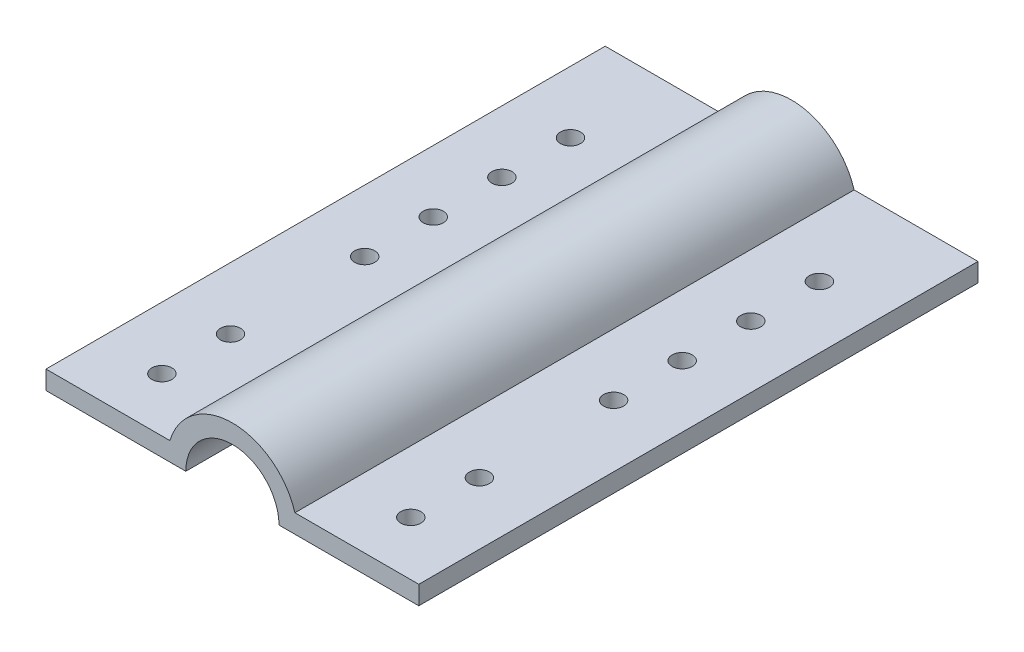
ISO-10303-21;
HEADER;
FILE_DESCRIPTION(('STEP AP214'),'2;1');
FILE_NAME('part.step','',(''),(''),'','','');
FILE_SCHEMA(('AUTOMOTIVE_DESIGN { 1 0 10303 214 1 1 1 1 }'));
ENDSEC;
DATA;
#1=APPLICATION_CONTEXT('core data for automotive mechanical design processes');
#2=APPLICATION_PROTOCOL_DEFINITION('international standard','automotive_design',2000,#1);
#3=PRODUCT_CONTEXT('',#1,'mechanical');
#4=PRODUCT('Part','Part','',(#3));
#5=PRODUCT_RELATED_PRODUCT_CATEGORY('part','',(#4));
#6=PRODUCT_DEFINITION_FORMATION('','',#4);
#7=PRODUCT_DEFINITION_CONTEXT('part definition',#1,'design');
#8=PRODUCT_DEFINITION('design','',#6,#7);
#9=PRODUCT_DEFINITION_SHAPE('','',#8);
#10=(LENGTH_UNIT() NAMED_UNIT(*) SI_UNIT(.MILLI.,.METRE.));
#11=(NAMED_UNIT(*) PLANE_ANGLE_UNIT() SI_UNIT($,.RADIAN.));
#12=(NAMED_UNIT(*) SI_UNIT($,.STERADIAN.) SOLID_ANGLE_UNIT());
#13=UNCERTAINTY_MEASURE_WITH_UNIT(LENGTH_MEASURE(1.E-05),#10,'distance_accuracy_value','');
#14=(GEOMETRIC_REPRESENTATION_CONTEXT(3) GLOBAL_UNCERTAINTY_ASSIGNED_CONTEXT((#13)) GLOBAL_UNIT_ASSIGNED_CONTEXT((#10,
#11,#12)) REPRESENTATION_CONTEXT('',''));
#15=CARTESIAN_POINT('',(0.,0.,0.));
#16=DIRECTION('',(0.,0.,1.));
#17=DIRECTION('',(1.,0.,0.));
#18=AXIS2_PLACEMENT_3D('',#15,#16,#17);
#19=CARTESIAN_POINT('',(-12.5,0.,-50.));
#20=DIRECTION('',(0.,1.,0.));
#21=DIRECTION('',(-1.,0.,0.));
#22=AXIS2_PLACEMENT_3D('',#19,#20,#21);
#23=PLANE('',#22);
#24=CARTESIAN_POINT('',(-33.3852549156242,0.,85.53));
#25=DIRECTION('',(0.,1.,0.));
#26=DIRECTION('',(-1.,0.,0.));
#27=AXIS2_PLACEMENT_3D('',#24,#25,#26);
#28=CIRCLE('',#27,2.69999999999999);
#29=CARTESIAN_POINT('',(-36.0852549156242,0.,85.53));
#30=VERTEX_POINT('',#29);
#31=EDGE_CURVE('E327',#30,#30,#28,.T.);
#32=ORIENTED_EDGE('',*,*,#31,.T.);
#33=EDGE_LOOP('',(#32));
#34=FACE_BOUND('',#33,.T.);
#35=CARTESIAN_POINT('',(-33.3852549156242,0.,67.13));
#36=DIRECTION('',(0.,1.,0.));
#37=DIRECTION('',(-1.,0.,0.));
#38=AXIS2_PLACEMENT_3D('',#35,#36,#37);
#39=CIRCLE('',#38,2.69999999999999);
#40=CARTESIAN_POINT('',(-36.0852549156242,0.,67.13));
#41=VERTEX_POINT('',#40);
#42=EDGE_CURVE('E319',#41,#41,#39,.T.);
#43=ORIENTED_EDGE('',*,*,#42,.T.);
#44=EDGE_LOOP('',(#43));
#45=FACE_BOUND('',#44,.T.);
#46=CARTESIAN_POINT('',(-33.3852549156242,0.,31.13));
#47=DIRECTION('',(0.,1.,0.));
#48=DIRECTION('',(-1.,0.,0.));
#49=AXIS2_PLACEMENT_3D('',#46,#47,#48);
#50=CIRCLE('',#49,2.7);
#51=CARTESIAN_POINT('',(-36.0852549156242,0.,31.13));
#52=VERTEX_POINT('',#51);
#53=EDGE_CURVE('E311',#52,#52,#50,.T.);
#54=ORIENTED_EDGE('',*,*,#53,.T.);
#55=EDGE_LOOP('',(#54));
#56=FACE_BOUND('',#55,.T.);
#57=CARTESIAN_POINT('',(-33.3852549156242,0.,12.73));
#58=DIRECTION('',(0.,1.,0.));
#59=DIRECTION('',(-1.,0.,0.));
#60=AXIS2_PLACEMENT_3D('',#57,#58,#59);
#61=CIRCLE('',#60,2.7);
#62=CARTESIAN_POINT('',(-36.0852549156242,0.,12.73));
#63=VERTEX_POINT('',#62);
#64=EDGE_CURVE('E303',#63,#63,#61,.T.);
#65=ORIENTED_EDGE('',*,*,#64,.T.);
#66=EDGE_LOOP('',(#65));
#67=FACE_BOUND('',#66,.T.);
#68=CARTESIAN_POINT('',(-33.3852549156242,0.,-5.67));
#69=DIRECTION('',(0.,1.,0.));
#70=DIRECTION('',(-1.,0.,0.));
#71=AXIS2_PLACEMENT_3D('',#68,#69,#70);
#72=CIRCLE('',#71,2.7);
#73=CARTESIAN_POINT('',(-36.0852549156242,0.,-5.67));
#74=VERTEX_POINT('',#73);
#75=EDGE_CURVE('E295',#74,#74,#72,.T.);
#76=ORIENTED_EDGE('',*,*,#75,.T.);
#77=EDGE_LOOP('',(#76));
#78=FACE_BOUND('',#77,.T.);
#79=CARTESIAN_POINT('',(-33.3852549156242,0.,-24.07));
#80=DIRECTION('',(0.,1.,0.));
#81=DIRECTION('',(-1.,0.,0.));
#82=AXIS2_PLACEMENT_3D('',#79,#80,#81);
#83=CIRCLE('',#82,2.7);
#84=CARTESIAN_POINT('',(-36.0852549156242,0.,-24.07));
#85=VERTEX_POINT('',#84);
#86=EDGE_CURVE('E291',#85,#85,#83,.T.);
#87=ORIENTED_EDGE('',*,*,#86,.T.);
#88=EDGE_LOOP('',(#87));
#89=FACE_BOUND('',#88,.T.);
#90=DIRECTION('',(0.,0.,1.));
#91=VECTOR('',#90,1.);
#92=CARTESIAN_POINT('',(-12.5,0.,-50.));
#93=LINE('',#92,#91);
#94=CARTESIAN_POINT('',(-12.5,0.,-50.));
#95=VERTEX_POINT('',#94);
#96=CARTESIAN_POINT('',(-12.5,0.,28.7353643915636));
#97=VERTEX_POINT('',#96);
#98=EDGE_CURVE('E164',#95,#97,#93,.T.);
#99=ORIENTED_EDGE('',*,*,#98,.T.);
#100=CARTESIAN_POINT('',(0.,0.,50.0437672996852));
#101=DIRECTION('',(0.,-1.,0.));
#102=DIRECTION('',(1.,0.,0.));
#103=AXIS2_PLACEMENT_3D('',#100,#101,#102);
#104=CIRCLE('',#103,24.704210865657);
#105=CARTESIAN_POINT('',(-12.5,0.,71.3521702078068));
#106=VERTEX_POINT('',#105);
#107=EDGE_CURVE('E256',#106,#97,#104,.T.);
#108=ORIENTED_EDGE('',*,*,#107,.F.);
#109=CARTESIAN_POINT('',(-12.5,0.,100.));
#110=VERTEX_POINT('',#109);
#111=EDGE_CURVE('E248',#106,#110,#93,.T.);
#112=ORIENTED_EDGE('',*,*,#111,.T.);
#113=DIRECTION('',(-1.,0.,0.));
#114=VECTOR('',#113,1.);
#115=CARTESIAN_POINT('',(-12.5,0.,100.));
#116=LINE('',#115,#114);
#117=CARTESIAN_POINT('',(-50.,0.,100.));
#118=VERTEX_POINT('',#117);
#119=EDGE_CURVE('E203',#110,#118,#116,.T.);
#120=ORIENTED_EDGE('',*,*,#119,.T.);
#121=DIRECTION('',(0.,0.,1.));
#122=VECTOR('',#121,1.);
#123=CARTESIAN_POINT('',(-50.,0.,-50.));
#124=LINE('',#123,#122);
#125=CARTESIAN_POINT('',(-50.,0.,-50.));
#126=VERTEX_POINT('',#125);
#127=EDGE_CURVE('E11',#126,#118,#124,.T.);
#128=ORIENTED_EDGE('',*,*,#127,.F.);
#129=DIRECTION('',(-1.,0.,0.));
#130=VECTOR('',#129,1.);
#131=CARTESIAN_POINT('',(-12.5,0.,-50.));
#132=LINE('',#131,#130);
#133=EDGE_CURVE('E228',#95,#126,#132,.T.);
#134=ORIENTED_EDGE('',*,*,#133,.F.);
#135=EDGE_LOOP('',(#99,#108,#112,#120,#128,#134));
#136=FACE_BOUND('',#135,.T.);
#137=ADVANCED_FACE('F39',(#34,#45,#56,#67,#78,#89,#136),#23,.F.);
#138=CARTESIAN_POINT('',(-50.,4.99999999999999,-50.));
#139=DIRECTION('',(-1.,0.,0.));
#140=DIRECTION('',(0.,0.,1.));
#141=AXIS2_PLACEMENT_3D('',#138,#139,#140);
#142=PLANE('',#141);
#143=ORIENTED_EDGE('',*,*,#127,.T.);
#144=DIRECTION('',(0.,-1.,0.));
#145=VECTOR('',#144,1.);
#146=CARTESIAN_POINT('',(-50.,4.99999999999999,100.));
#147=LINE('',#146,#145);
#148=CARTESIAN_POINT('',(-50.,4.99999999999999,100.));
#149=VERTEX_POINT('',#148);
#150=EDGE_CURVE('E193',#149,#118,#147,.T.);
#151=ORIENTED_EDGE('',*,*,#150,.F.);
#152=DIRECTION('',(0.,0.,1.));
#153=VECTOR('',#152,1.);
#154=CARTESIAN_POINT('',(-50.,4.99999999999999,-50.));
#155=LINE('',#154,#153);
#156=CARTESIAN_POINT('',(-50.,4.99999999999999,-50.));
#157=VERTEX_POINT('',#156);
#158=EDGE_CURVE('E47',#157,#149,#155,.T.);
#159=ORIENTED_EDGE('',*,*,#158,.F.);
#160=DIRECTION('',(0.,-1.,0.));
#161=VECTOR('',#160,1.);
#162=CARTESIAN_POINT('',(-50.,4.99999999999999,-50.));
#163=LINE('',#162,#161);
#164=EDGE_CURVE('E231',#157,#126,#163,.T.);
#165=ORIENTED_EDGE('',*,*,#164,.T.);
#166=EDGE_LOOP('',(#143,#151,#159,#165));
#167=FACE_BOUND('',#166,.T.);
#168=ADVANCED_FACE('F200',(#167),#142,.T.);
#169=CARTESIAN_POINT('',(-16.7705098312484,5.,-50.));
#170=DIRECTION('',(0.,1.,0.));
#171=DIRECTION('',(-1.,0.,0.));
#172=AXIS2_PLACEMENT_3D('',#169,#170,#171);
#173=PLANE('',#172);
#174=CARTESIAN_POINT('',(-33.3852549156242,4.99999999999999,85.53));
#175=DIRECTION('',(0.,1.,0.));
#176=DIRECTION('',(-1.,0.,0.));
#177=AXIS2_PLACEMENT_3D('',#174,#175,#176);
#178=CIRCLE('',#177,2.69999999999999);
#179=CARTESIAN_POINT('',(-36.0852549156242,4.99999999999999,85.53));
#180=VERTEX_POINT('',#179);
#181=EDGE_CURVE('E331',#180,#180,#178,.F.);
#182=ORIENTED_EDGE('',*,*,#181,.T.);
#183=EDGE_LOOP('',(#182));
#184=FACE_BOUND('',#183,.T.);
#185=CARTESIAN_POINT('',(-33.3852549156242,4.99999999999999,67.13));
#186=DIRECTION('',(0.,1.,0.));
#187=DIRECTION('',(-1.,0.,0.));
#188=AXIS2_PLACEMENT_3D('',#185,#186,#187);
#189=CIRCLE('',#188,2.69999999999999);
#190=CARTESIAN_POINT('',(-36.0852549156242,4.99999999999999,67.13));
#191=VERTEX_POINT('',#190);
#192=EDGE_CURVE('E323',#191,#191,#189,.F.);
#193=ORIENTED_EDGE('',*,*,#192,.T.);
#194=EDGE_LOOP('',(#193));
#195=FACE_BOUND('',#194,.T.);
#196=CARTESIAN_POINT('',(-33.3852549156242,4.99999999999999,31.13));
#197=DIRECTION('',(0.,1.,0.));
#198=DIRECTION('',(-1.,0.,0.));
#199=AXIS2_PLACEMENT_3D('',#196,#197,#198);
#200=CIRCLE('',#199,2.7);
#201=CARTESIAN_POINT('',(-36.0852549156242,4.99999999999999,31.13));
#202=VERTEX_POINT('',#201);
#203=EDGE_CURVE('E315',#202,#202,#200,.F.);
#204=ORIENTED_EDGE('',*,*,#203,.T.);
#205=EDGE_LOOP('',(#204));
#206=FACE_BOUND('',#205,.T.);
#207=CARTESIAN_POINT('',(-33.3852549156242,4.99999999999999,12.73));
#208=DIRECTION('',(0.,1.,0.));
#209=DIRECTION('',(-1.,0.,0.));
#210=AXIS2_PLACEMENT_3D('',#207,#208,#209);
#211=CIRCLE('',#210,2.7);
#212=CARTESIAN_POINT('',(-36.0852549156242,4.99999999999999,12.73));
#213=VERTEX_POINT('',#212);
#214=EDGE_CURVE('E307',#213,#213,#211,.F.);
#215=ORIENTED_EDGE('',*,*,#214,.T.);
#216=EDGE_LOOP('',(#215));
#217=FACE_BOUND('',#216,.T.);
#218=CARTESIAN_POINT('',(-33.3852549156242,4.99999999999999,-5.67));
#219=DIRECTION('',(0.,1.,0.));
#220=DIRECTION('',(-1.,0.,0.));
#221=AXIS2_PLACEMENT_3D('',#218,#219,#220);
#222=CIRCLE('',#221,2.7);
#223=CARTESIAN_POINT('',(-36.0852549156242,4.99999999999999,-5.67));
#224=VERTEX_POINT('',#223);
#225=EDGE_CURVE('E299',#224,#224,#222,.F.);
#226=ORIENTED_EDGE('',*,*,#225,.T.);
#227=EDGE_LOOP('',(#226));
#228=FACE_BOUND('',#227,.T.);
#229=CARTESIAN_POINT('',(-33.3852549156242,4.99999999999999,-24.07));
#230=DIRECTION('',(0.,1.,0.));
#231=DIRECTION('',(-1.,0.,0.));
#232=AXIS2_PLACEMENT_3D('',#229,#230,#231);
#233=CIRCLE('',#232,2.7);
#234=CARTESIAN_POINT('',(-36.0852549156242,4.99999999999999,-24.07));
#235=VERTEX_POINT('',#234);
#236=EDGE_CURVE('E151',#235,#235,#233,.F.);
#237=ORIENTED_EDGE('',*,*,#236,.T.);
#238=EDGE_LOOP('',(#237));
#239=FACE_BOUND('',#238,.T.);
#240=ORIENTED_EDGE('',*,*,#158,.T.);
#241=DIRECTION('',(-1.,0.,0.));
#242=VECTOR('',#241,1.);
#243=CARTESIAN_POINT('',(-16.7705098312484,5.,100.));
#244=LINE('',#243,#242);
#245=CARTESIAN_POINT('',(-16.7705098312484,5.,100.));
#246=VERTEX_POINT('',#245);
#247=EDGE_CURVE('E181',#246,#149,#244,.T.);
#248=ORIENTED_EDGE('',*,*,#247,.F.);
#249=DIRECTION('',(0.,0.,1.));
#250=VECTOR('',#249,1.);
#251=CARTESIAN_POINT('',(-16.7705098312484,5.,-50.));
#252=LINE('',#251,#250);
#253=CARTESIAN_POINT('',(-16.7705098312484,5.,-50.));
#254=VERTEX_POINT('',#253);
#255=EDGE_CURVE('E173',#254,#246,#252,.T.);
#256=ORIENTED_EDGE('',*,*,#255,.F.);
#257=DIRECTION('',(-1.,0.,0.));
#258=VECTOR('',#257,1.);
#259=CARTESIAN_POINT('',(-16.7705098312484,5.,-50.));
#260=LINE('',#259,#258);
#261=EDGE_CURVE('E184',#254,#157,#260,.T.);
#262=ORIENTED_EDGE('',*,*,#261,.T.);
#263=EDGE_LOOP('',(#240,#248,#256,#262));
#264=FACE_BOUND('',#263,.T.);
#265=ADVANCED_FACE('F180',(#184,#195,#206,#217,#228,#239,#264),#173,.T.);
#266=CARTESIAN_POINT('',(0.,0.,-50.));
#267=DIRECTION('',(0.,0.,1.));
#268=DIRECTION('',(1.,0.,0.));
#269=AXIS2_PLACEMENT_3D('',#266,#267,#268);
#270=CYLINDRICAL_SURFACE('',#269,17.5);
#271=ORIENTED_EDGE('',*,*,#255,.T.);
#272=CARTESIAN_POINT('',(0.,0.,100.));
#273=DIRECTION('',(0.,0.,-1.));
#274=DIRECTION('',(-1.,0.,0.));
#275=AXIS2_PLACEMENT_3D('',#272,#273,#274);
#276=CIRCLE('',#275,17.5);
#277=CARTESIAN_POINT('',(16.7705098312484,5.,100.));
#278=VERTEX_POINT('',#277);
#279=EDGE_CURVE('E197',#246,#278,#276,.T.);
#280=ORIENTED_EDGE('',*,*,#279,.T.);
#281=DIRECTION('',(0.,0.,1.));
#282=VECTOR('',#281,1.);
#283=CARTESIAN_POINT('',(16.7705098312484,5.,-50.));
#284=LINE('',#283,#282);
#285=CARTESIAN_POINT('',(16.7705098312484,5.,-50.));
#286=VERTEX_POINT('',#285);
#287=EDGE_CURVE('E170',#286,#278,#284,.T.);
#288=ORIENTED_EDGE('',*,*,#287,.F.);
#289=CARTESIAN_POINT('',(0.,0.,-50.));
#290=DIRECTION('',(0.,0.,-1.));
#291=DIRECTION('',(-1.,0.,0.));
#292=AXIS2_PLACEMENT_3D('',#289,#290,#291);
#293=CIRCLE('',#292,17.5);
#294=EDGE_CURVE('E236',#254,#286,#293,.T.);
#295=ORIENTED_EDGE('',*,*,#294,.F.);
#296=EDGE_LOOP('',(#271,#280,#288,#295));
#297=FACE_BOUND('',#296,.T.);
#298=ADVANCED_FACE('F391',(#297),#270,.T.);
#299=CARTESIAN_POINT('',(16.7705098312484,5.,-50.));
#300=DIRECTION('',(0.,-1.,0.));
#301=DIRECTION('',(1.,0.,0.));
#302=AXIS2_PLACEMENT_3D('',#299,#300,#301);
#303=PLANE('',#302);
#304=CARTESIAN_POINT('',(33.3852549156242,5.00000000000001,-24.07));
#305=DIRECTION('',(0.,1.,0.));
#306=DIRECTION('',(-1.,0.,0.));
#307=AXIS2_PLACEMENT_3D('',#304,#305,#306);
#308=CIRCLE('',#307,2.7);
#309=CARTESIAN_POINT('',(30.6852549156242,5.00000000000001,-24.07));
#310=VERTEX_POINT('',#309);
#311=EDGE_CURVE('E339',#310,#310,#308,.T.);
#312=ORIENTED_EDGE('',*,*,#311,.F.);
#313=EDGE_LOOP('',(#312));
#314=FACE_BOUND('',#313,.T.);
#315=CARTESIAN_POINT('',(33.3852549156242,5.00000000000001,-5.67000000000001));
#316=DIRECTION('',(0.,1.,0.));
#317=DIRECTION('',(-1.,0.,0.));
#318=AXIS2_PLACEMENT_3D('',#315,#316,#317);
#319=CIRCLE('',#318,2.7);
#320=CARTESIAN_POINT('',(30.6852549156242,5.00000000000001,-5.67000000000001));
#321=VERTEX_POINT('',#320);
#322=EDGE_CURVE('E347',#321,#321,#319,.T.);
#323=ORIENTED_EDGE('',*,*,#322,.F.);
#324=EDGE_LOOP('',(#323));
#325=FACE_BOUND('',#324,.T.);
#326=CARTESIAN_POINT('',(33.3852549156242,5.00000000000001,31.13));
#327=DIRECTION('',(0.,1.,0.));
#328=DIRECTION('',(-1.,0.,0.));
#329=AXIS2_PLACEMENT_3D('',#326,#327,#328);
#330=CIRCLE('',#329,2.7);
#331=CARTESIAN_POINT('',(30.6852549156242,5.00000000000001,31.13));
#332=VERTEX_POINT('',#331);
#333=EDGE_CURVE('E355',#332,#332,#330,.T.);
#334=ORIENTED_EDGE('',*,*,#333,.F.);
#335=EDGE_LOOP('',(#334));
#336=FACE_BOUND('',#335,.T.);
#337=CARTESIAN_POINT('',(33.3852549156242,5.00000000000001,67.13));
#338=DIRECTION('',(0.,1.,0.));
#339=DIRECTION('',(-1.,0.,0.));
#340=AXIS2_PLACEMENT_3D('',#337,#338,#339);
#341=CIRCLE('',#340,2.7);
#342=CARTESIAN_POINT('',(30.6852549156242,5.00000000000001,67.13));
#343=VERTEX_POINT('',#342);
#344=EDGE_CURVE('E363',#343,#343,#341,.T.);
#345=ORIENTED_EDGE('',*,*,#344,.F.);
#346=EDGE_LOOP('',(#345));
#347=FACE_BOUND('',#346,.T.);
#348=CARTESIAN_POINT('',(33.3852549156242,5.00000000000001,85.53));
#349=DIRECTION('',(0.,1.,0.));
#350=DIRECTION('',(-1.,0.,0.));
#351=AXIS2_PLACEMENT_3D('',#348,#349,#350);
#352=CIRCLE('',#351,2.7);
#353=CARTESIAN_POINT('',(30.6852549156242,5.00000000000001,85.53));
#354=VERTEX_POINT('',#353);
#355=EDGE_CURVE('E371',#354,#354,#352,.T.);
#356=ORIENTED_EDGE('',*,*,#355,.F.);
#357=EDGE_LOOP('',(#356));
#358=FACE_BOUND('',#357,.T.);
#359=CARTESIAN_POINT('',(33.3852549156242,5.00000000000001,12.73));
#360=DIRECTION('',(0.,1.,0.));
#361=DIRECTION('',(-1.,0.,0.));
#362=AXIS2_PLACEMENT_3D('',#359,#360,#361);
#363=CIRCLE('',#362,2.7);
#364=CARTESIAN_POINT('',(30.6852549156242,5.00000000000001,12.73));
#365=VERTEX_POINT('',#364);
#366=EDGE_CURVE('E379',#365,#365,#363,.T.);
#367=ORIENTED_EDGE('',*,*,#366,.F.);
#368=EDGE_LOOP('',(#367));
#369=FACE_BOUND('',#368,.T.);
#370=ORIENTED_EDGE('',*,*,#287,.T.);
#371=DIRECTION('',(1.,0.,0.));
#372=VECTOR('',#371,1.);
#373=CARTESIAN_POINT('',(16.7705098312484,5.,100.));
#374=LINE('',#373,#372);
#375=CARTESIAN_POINT('',(50.,5.00000000000001,100.));
#376=VERTEX_POINT('',#375);
#377=EDGE_CURVE('E212',#278,#376,#374,.T.);
#378=ORIENTED_EDGE('',*,*,#377,.T.);
#379=DIRECTION('',(0.,0.,1.));
#380=VECTOR('',#379,1.);
#381=CARTESIAN_POINT('',(50.,5.00000000000001,-50.));
#382=LINE('',#381,#380);
#383=CARTESIAN_POINT('',(50.,5.00000000000001,-50.));
#384=VERTEX_POINT('',#383);
#385=EDGE_CURVE('E162',#384,#376,#382,.T.);
#386=ORIENTED_EDGE('',*,*,#385,.F.);
#387=DIRECTION('',(1.,0.,0.));
#388=VECTOR('',#387,1.);
#389=CARTESIAN_POINT('',(16.7705098312484,5.,-50.));
#390=LINE('',#389,#388);
#391=EDGE_CURVE('E239',#286,#384,#390,.T.);
#392=ORIENTED_EDGE('',*,*,#391,.F.);
#393=EDGE_LOOP('',(#370,#378,#386,#392));
#394=FACE_BOUND('',#393,.T.);
#395=ADVANCED_FACE('F387',(#314,#325,#336,#347,#358,#369,#394),#303,.F.);
#396=CARTESIAN_POINT('',(50.,5.00000000000001,-50.));
#397=DIRECTION('',(-1.,0.,0.));
#398=DIRECTION('',(0.,0.,1.));
#399=AXIS2_PLACEMENT_3D('',#396,#397,#398);
#400=PLANE('',#399);
#401=ORIENTED_EDGE('',*,*,#385,.T.);
#402=DIRECTION('',(0.,-1.,0.));
#403=VECTOR('',#402,1.);
#404=CARTESIAN_POINT('',(50.,5.00000000000001,100.));
#405=LINE('',#404,#403);
#406=CARTESIAN_POINT('',(50.,0.,100.));
#407=VERTEX_POINT('',#406);
#408=EDGE_CURVE('E216',#376,#407,#405,.T.);
#409=ORIENTED_EDGE('',*,*,#408,.T.);
#410=DIRECTION('',(0.,0.,1.));
#411=VECTOR('',#410,1.);
#412=CARTESIAN_POINT('',(50.,0.,-50.));
#413=LINE('',#412,#411);
#414=CARTESIAN_POINT('',(50.,0.,-50.));
#415=VERTEX_POINT('',#414);
#416=EDGE_CURVE('E158',#415,#407,#413,.T.);
#417=ORIENTED_EDGE('',*,*,#416,.F.);
#418=DIRECTION('',(0.,-1.,0.));
#419=VECTOR('',#418,1.);
#420=CARTESIAN_POINT('',(50.,5.00000000000001,-50.));
#421=LINE('',#420,#419);
#422=EDGE_CURVE('E242',#384,#415,#421,.T.);
#423=ORIENTED_EDGE('',*,*,#422,.F.);
#424=EDGE_LOOP('',(#401,#409,#417,#423));
#425=FACE_BOUND('',#424,.T.);
#426=ADVANCED_FACE('F390',(#425),#400,.F.);
#427=CARTESIAN_POINT('',(12.5,0.,-50.));
#428=DIRECTION('',(0.,-1.,0.));
#429=DIRECTION('',(1.,0.,0.));
#430=AXIS2_PLACEMENT_3D('',#427,#428,#429);
#431=PLANE('',#430);
#432=CARTESIAN_POINT('',(33.3852549156242,0.,-24.07));
#433=DIRECTION('',(0.,-1.,0.));
#434=DIRECTION('',(1.,0.,0.));
#435=AXIS2_PLACEMENT_3D('',#432,#433,#434);
#436=CIRCLE('',#435,2.7);
#437=CARTESIAN_POINT('',(36.0852549156242,0.,-24.07));
#438=VERTEX_POINT('',#437);
#439=EDGE_CURVE('E335',#438,#438,#436,.F.);
#440=ORIENTED_EDGE('',*,*,#439,.T.);
#441=EDGE_LOOP('',(#440));
#442=FACE_BOUND('',#441,.T.);
#443=CARTESIAN_POINT('',(33.3852549156242,0.,-5.67000000000001));
#444=DIRECTION('',(0.,-1.,0.));
#445=DIRECTION('',(1.,0.,0.));
#446=AXIS2_PLACEMENT_3D('',#443,#444,#445);
#447=CIRCLE('',#446,2.7);
#448=CARTESIAN_POINT('',(36.0852549156242,0.,-5.67000000000001));
#449=VERTEX_POINT('',#448);
#450=EDGE_CURVE('E343',#449,#449,#447,.F.);
#451=ORIENTED_EDGE('',*,*,#450,.T.);
#452=EDGE_LOOP('',(#451));
#453=FACE_BOUND('',#452,.T.);
#454=CARTESIAN_POINT('',(33.3852549156242,0.,31.13));
#455=DIRECTION('',(0.,-1.,0.));
#456=DIRECTION('',(1.,0.,0.));
#457=AXIS2_PLACEMENT_3D('',#454,#455,#456);
#458=CIRCLE('',#457,2.7);
#459=CARTESIAN_POINT('',(36.0852549156242,0.,31.13));
#460=VERTEX_POINT('',#459);
#461=EDGE_CURVE('E351',#460,#460,#458,.F.);
#462=ORIENTED_EDGE('',*,*,#461,.T.);
#463=EDGE_LOOP('',(#462));
#464=FACE_BOUND('',#463,.T.);
#465=CARTESIAN_POINT('',(33.3852549156242,0.,67.13));
#466=DIRECTION('',(0.,-1.,0.));
#467=DIRECTION('',(1.,0.,0.));
#468=AXIS2_PLACEMENT_3D('',#465,#466,#467);
#469=CIRCLE('',#468,2.7);
#470=CARTESIAN_POINT('',(36.0852549156242,0.,67.13));
#471=VERTEX_POINT('',#470);
#472=EDGE_CURVE('E359',#471,#471,#469,.F.);
#473=ORIENTED_EDGE('',*,*,#472,.T.);
#474=EDGE_LOOP('',(#473));
#475=FACE_BOUND('',#474,.T.);
#476=CARTESIAN_POINT('',(33.3852549156242,0.,85.53));
#477=DIRECTION('',(0.,-1.,0.));
#478=DIRECTION('',(1.,0.,0.));
#479=AXIS2_PLACEMENT_3D('',#476,#477,#478);
#480=CIRCLE('',#479,2.7);
#481=CARTESIAN_POINT('',(36.0852549156242,0.,85.53));
#482=VERTEX_POINT('',#481);
#483=EDGE_CURVE('E367',#482,#482,#480,.F.);
#484=ORIENTED_EDGE('',*,*,#483,.T.);
#485=EDGE_LOOP('',(#484));
#486=FACE_BOUND('',#485,.T.);
#487=CARTESIAN_POINT('',(33.3852549156242,0.,12.73));
#488=DIRECTION('',(0.,-1.,0.));
#489=DIRECTION('',(1.,0.,0.));
#490=AXIS2_PLACEMENT_3D('',#487,#488,#489);
#491=CIRCLE('',#490,2.7);
#492=CARTESIAN_POINT('',(36.0852549156242,0.,12.73));
#493=VERTEX_POINT('',#492);
#494=EDGE_CURVE('E375',#493,#493,#491,.F.);
#495=ORIENTED_EDGE('',*,*,#494,.T.);
#496=EDGE_LOOP('',(#495));
#497=FACE_BOUND('',#496,.T.);
#498=CARTESIAN_POINT('',(0.,0.,50.0437672996852));
#499=DIRECTION('',(0.,-1.,0.));
#500=DIRECTION('',(-1.,0.,0.));
#501=AXIS2_PLACEMENT_3D('',#498,#499,#500);
#502=CIRCLE('',#501,24.704210865657);
#503=CARTESIAN_POINT('',(12.5,0.,28.7353643915636));
#504=VERTEX_POINT('',#503);
#505=CARTESIAN_POINT('',(12.5,0.,71.3521702078068));
#506=VERTEX_POINT('',#505);
#507=EDGE_CURVE('E133',#504,#506,#502,.T.);
#508=ORIENTED_EDGE('',*,*,#507,.F.);
#509=DIRECTION('',(0.,0.,1.));
#510=VECTOR('',#509,1.);
#511=CARTESIAN_POINT('',(12.5,0.,-50.));
#512=LINE('',#511,#510);
#513=CARTESIAN_POINT('',(12.5,0.,-50.));
#514=VERTEX_POINT('',#513);
#515=EDGE_CURVE('E146',#514,#504,#512,.T.);
#516=ORIENTED_EDGE('',*,*,#515,.F.);
#517=DIRECTION('',(1.,0.,0.));
#518=VECTOR('',#517,1.);
#519=CARTESIAN_POINT('',(12.5,0.,-50.));
#520=LINE('',#519,#518);
#521=EDGE_CURVE('E245',#514,#415,#520,.T.);
#522=ORIENTED_EDGE('',*,*,#521,.T.);
#523=ORIENTED_EDGE('',*,*,#416,.T.);
#524=DIRECTION('',(1.,0.,0.));
#525=VECTOR('',#524,1.);
#526=CARTESIAN_POINT('',(12.5,0.,100.));
#527=LINE('',#526,#525);
#528=CARTESIAN_POINT('',(12.5,0.,100.));
#529=VERTEX_POINT('',#528);
#530=EDGE_CURVE('E220',#529,#407,#527,.T.);
#531=ORIENTED_EDGE('',*,*,#530,.F.);
#532=EDGE_CURVE('E149',#506,#529,#512,.T.);
#533=ORIENTED_EDGE('',*,*,#532,.F.);
#534=EDGE_LOOP('',(#508,#516,#522,#523,#531,#533));
#535=FACE_BOUND('',#534,.T.);
#536=ADVANCED_FACE('F144',(#442,#453,#464,#475,#486,#497,#535),#431,.T.);
#537=CARTESIAN_POINT('',(0.,0.,-50.));
#538=DIRECTION('',(0.,0.,1.));
#539=DIRECTION('',(1.,0.,0.));
#540=AXIS2_PLACEMENT_3D('',#537,#538,#539);
#541=CYLINDRICAL_SURFACE('',#540,12.5);
#542=ORIENTED_EDGE('',*,*,#515,.T.);
#543=DIRECTION('',(0.,0.,-1.));
#544=VECTOR('',#543,1.);
#545=CARTESIAN_POINT('',(12.5,0.,71.3521702078068));
#546=LINE('',#545,#544);
#547=EDGE_CURVE('E127',#506,#504,#546,.T.);
#548=ORIENTED_EDGE('',*,*,#547,.F.);
#549=ORIENTED_EDGE('',*,*,#532,.T.);
#550=CARTESIAN_POINT('',(0.,0.,100.));
#551=DIRECTION('',(0.,0.,-1.));
#552=DIRECTION('',(-1.,0.,0.));
#553=AXIS2_PLACEMENT_3D('',#550,#551,#552);
#554=CIRCLE('',#553,12.5);
#555=EDGE_CURVE('E224',#110,#529,#554,.T.);
#556=ORIENTED_EDGE('',*,*,#555,.F.);
#557=ORIENTED_EDGE('',*,*,#111,.F.);
#558=DIRECTION('',(0.,0.,1.));
#559=VECTOR('',#558,1.);
#560=CARTESIAN_POINT('',(-12.5,0.,71.3521702078068));
#561=LINE('',#560,#559);
#562=EDGE_CURVE('E62',#97,#106,#561,.T.);
#563=ORIENTED_EDGE('',*,*,#562,.F.);
#564=ORIENTED_EDGE('',*,*,#98,.F.);
#565=CARTESIAN_POINT('',(0.,0.,-50.));
#566=DIRECTION('',(0.,0.,-1.));
#567=DIRECTION('',(-1.,0.,0.));
#568=AXIS2_PLACEMENT_3D('',#565,#566,#567);
#569=CIRCLE('',#568,12.5);
#570=EDGE_CURVE('E156',#95,#514,#569,.T.);
#571=ORIENTED_EDGE('',*,*,#570,.T.);
#572=EDGE_LOOP('',(#542,#548,#549,#556,#557,#563,#564,#571));
#573=FACE_BOUND('',#572,.T.);
#574=ADVANCED_FACE('F154',(#573),#541,.F.);
#575=CARTESIAN_POINT('',(0.,0.,-50.));
#576=DIRECTION('',(0.,0.,-1.));
#577=DIRECTION('',(-1.,0.,0.));
#578=AXIS2_PLACEMENT_3D('',#575,#576,#577);
#579=PLANE('',#578);
#580=ORIENTED_EDGE('',*,*,#133,.T.);
#581=ORIENTED_EDGE('',*,*,#164,.F.);
#582=ORIENTED_EDGE('',*,*,#261,.F.);
#583=ORIENTED_EDGE('',*,*,#294,.T.);
#584=ORIENTED_EDGE('',*,*,#391,.T.);
#585=ORIENTED_EDGE('',*,*,#422,.T.);
#586=ORIENTED_EDGE('',*,*,#521,.F.);
#587=ORIENTED_EDGE('',*,*,#570,.F.);
#588=EDGE_LOOP('',(#580,#581,#582,#583,#584,#585,#586,#587));
#589=FACE_BOUND('',#588,.T.);
#590=ADVANCED_FACE('F401',(#589),#579,.T.);
#591=CARTESIAN_POINT('',(0.,0.,100.));
#592=DIRECTION('',(0.,0.,-1.));
#593=DIRECTION('',(-1.,0.,0.));
#594=AXIS2_PLACEMENT_3D('',#591,#592,#593);
#595=PLANE('',#594);
#596=ORIENTED_EDGE('',*,*,#119,.F.);
#597=ORIENTED_EDGE('',*,*,#555,.T.);
#598=ORIENTED_EDGE('',*,*,#530,.T.);
#599=ORIENTED_EDGE('',*,*,#408,.F.);
#600=ORIENTED_EDGE('',*,*,#377,.F.);
#601=ORIENTED_EDGE('',*,*,#279,.F.);
#602=ORIENTED_EDGE('',*,*,#247,.T.);
#603=ORIENTED_EDGE('',*,*,#150,.T.);
#604=EDGE_LOOP('',(#596,#597,#598,#599,#600,#601,#602,#603));
#605=FACE_BOUND('',#604,.T.);
#606=ADVANCED_FACE('F192',(#605),#595,.F.);
#607=CARTESIAN_POINT('',(0.,-13.6330999818407,48.0549131000422));
#608=DIRECTION('',(0.,-1.,0.));
#609=DIRECTION('',(1.,0.,0.));
#610=AXIS2_PLACEMENT_3D('',#607,#608,#609);
#611=PLANE('',#610);
#612=CARTESIAN_POINT('',(0.,-13.6330999818407,48.0549131000422));
#613=DIRECTION('',(0.,-1.,0.));
#614=DIRECTION('',(1.,0.,0.));
#615=AXIS2_PLACEMENT_3D('',#612,#613,#614);
#616=CIRCLE('',#615,24.704210865657);
#617=CARTESIAN_POINT('',(-12.5,-13.6330999818407,69.3633160081638));
#618=VERTEX_POINT('',#617);
#619=CARTESIAN_POINT('',(-12.5,-13.6330999818407,26.7465101919206));
#620=VERTEX_POINT('',#619);
#621=EDGE_CURVE('E273',#618,#620,#616,.T.);
#622=ORIENTED_EDGE('',*,*,#621,.T.);
#623=DIRECTION('',(0.,0.,1.));
#624=VECTOR('',#623,1.);
#625=CARTESIAN_POINT('',(-12.5,-13.6330999818407,69.3633160081638));
#626=LINE('',#625,#624);
#627=EDGE_CURVE('E206',#620,#618,#626,.T.);
#628=ORIENTED_EDGE('',*,*,#627,.T.);
#629=EDGE_LOOP('',(#622,#628));
#630=FACE_BOUND('',#629,.T.);
#631=ADVANCED_FACE('F462',(#630),#611,.T.);
#632=CARTESIAN_POINT('',(-12.5,0.,71.3521702078068));
#633=CARTESIAN_POINT('',(-12.5,-13.6330999818407,69.3633160081638));
#634=CARTESIAN_POINT('',(-30.7700027457258,0.,60.6345657347597));
#635=CARTESIAN_POINT('',(-30.7700027457258,-13.6330999818407,58.6457115351168));
#636=CARTESIAN_POINT('',(-30.7700027457258,0.,39.4529688646107));
#637=CARTESIAN_POINT('',(-30.7700027457258,-13.6330999818407,37.4641146649677));
#638=CARTESIAN_POINT('',(-12.5,0.,28.7353643915636));
#639=CARTESIAN_POINT('',(-12.5,-13.6330999818407,26.7465101919206));
#640=(BOUNDED_SURFACE() B_SPLINE_SURFACE(3,1,((#632,#633),(#634,#635),(#636,#637),(#638,#639)),
.UNSPECIFIED.,.F.,.F.,.F.) B_SPLINE_SURFACE_WITH_KNOTS((4,4),(2,2),(0.,1.),(0.,1.),
.UNSPECIFIED.) GEOMETRIC_REPRESENTATION_ITEM() RATIONAL_B_SPLINE_SURFACE(((1.,1.),
(0.670657742465465,0.670657742465465),(0.670657742465465,0.670657742465465),(1.,1.))) REPRESENTATION_ITEM('') SURFACE());
#641=DIRECTION('',(0.,-0.989525789068971,-0.144356201000964));
#642=VECTOR('',#641,1.);
#643=CARTESIAN_POINT('',(-12.5,0.,28.7353643915636));
#644=LINE('',#643,#642);
#645=EDGE_CURVE('E263',#97,#620,#644,.T.);
#646=DIRECTION('',(0.,-0.989525789068971,-0.144356201000964));
#647=VECTOR('',#646,1.);
#648=CARTESIAN_POINT('',(-12.5,0.,71.3521702078068));
#649=LINE('',#648,#647);
#650=EDGE_CURVE('E265',#106,#618,#649,.T.);
#651=ORIENTED_EDGE('',*,*,#645,.T.);
#652=ORIENTED_EDGE('',*,*,#621,.F.);
#653=ORIENTED_EDGE('',*,*,#650,.F.);
#654=ORIENTED_EDGE('',*,*,#107,.T.);
#655=EDGE_LOOP('',(#651,#652,#653,#654));
#656=FACE_BOUND('',#655,.T.);
#657=ADVANCED_FACE('F261',(#656),#640,.T.);
#658=CARTESIAN_POINT('',(-12.5,0.,71.3521702078068));
#659=DIRECTION('',(1.,0.,0.));
#660=DIRECTION('',(0.,0.,-1.));
#661=AXIS2_PLACEMENT_3D('',#658,#659,#660);
#662=PLANE('',#661);
#663=ORIENTED_EDGE('',*,*,#627,.F.);
#664=ORIENTED_EDGE('',*,*,#645,.F.);
#665=ORIENTED_EDGE('',*,*,#562,.T.);
#666=ORIENTED_EDGE('',*,*,#650,.T.);
#667=EDGE_LOOP('',(#663,#664,#665,#666));
#668=FACE_BOUND('',#667,.T.);
#669=ADVANCED_FACE('F271',(#668),#662,.T.);
#670=CARTESIAN_POINT('',(0.,-13.6330999818407,48.0549131000422));
#671=DIRECTION('',(0.,1.,0.));
#672=DIRECTION('',(-1.,0.,0.));
#673=AXIS2_PLACEMENT_3D('',#670,#671,#672);
#674=PLANE('',#673);
#675=CARTESIAN_POINT('',(0.,-13.6330999818407,48.0549131000422));
#676=DIRECTION('',(0.,-1.,0.));
#677=DIRECTION('',(-1.,0.,0.));
#678=AXIS2_PLACEMENT_3D('',#675,#676,#677);
#679=CIRCLE('',#678,24.704210865657);
#680=CARTESIAN_POINT('',(12.5,-13.6330999818407,26.7465101919206));
#681=VERTEX_POINT('',#680);
#682=CARTESIAN_POINT('',(12.5,-13.6330999818407,69.3633160081638));
#683=VERTEX_POINT('',#682);
#684=EDGE_CURVE('E140',#681,#683,#679,.T.);
#685=ORIENTED_EDGE('',*,*,#684,.T.);
#686=DIRECTION('',(0.,0.,-1.));
#687=VECTOR('',#686,1.);
#688=CARTESIAN_POINT('',(12.5,-13.6330999818407,69.3633160081638));
#689=LINE('',#688,#687);
#690=EDGE_CURVE('E267',#683,#681,#689,.T.);
#691=ORIENTED_EDGE('',*,*,#690,.T.);
#692=EDGE_LOOP('',(#685,#691));
#693=FACE_BOUND('',#692,.T.);
#694=ADVANCED_FACE('F454',(#693),#674,.F.);
#695=CARTESIAN_POINT('',(12.5,0.,28.7353643915636));
#696=CARTESIAN_POINT('',(12.5,-13.6330999818407,26.7465101919206));
#697=CARTESIAN_POINT('',(30.7700027457258,0.,39.4529688646107));
#698=CARTESIAN_POINT('',(30.7700027457258,-13.6330999818407,37.4641146649677));
#699=CARTESIAN_POINT('',(30.7700027457258,0.,60.6345657347597));
#700=CARTESIAN_POINT('',(30.7700027457258,-13.6330999818407,58.6457115351168));
#701=CARTESIAN_POINT('',(12.5,0.,71.3521702078068));
#702=CARTESIAN_POINT('',(12.5,-13.6330999818407,69.3633160081638));
#703=(BOUNDED_SURFACE() B_SPLINE_SURFACE(3,1,((#695,#696),(#697,#698),(#699,#700),(#701,#702)),
.UNSPECIFIED.,.F.,.F.,.F.) B_SPLINE_SURFACE_WITH_KNOTS((4,4),(2,2),(0.,1.),(0.,1.),
.UNSPECIFIED.) GEOMETRIC_REPRESENTATION_ITEM() RATIONAL_B_SPLINE_SURFACE(((1.,1.),
(0.670657742465465,0.670657742465465),(0.670657742465465,0.670657742465465),(1.,1.))) REPRESENTATION_ITEM('') SURFACE());
#704=DIRECTION('',(0.,-0.989525789068971,-0.144356201000964));
#705=VECTOR('',#704,1.);
#706=CARTESIAN_POINT('',(12.5,0.,71.3521702078068));
#707=LINE('',#706,#705);
#708=EDGE_CURVE('E54',#506,#683,#707,.T.);
#709=DIRECTION('',(0.,-0.989525789068971,-0.144356201000964));
#710=VECTOR('',#709,1.);
#711=CARTESIAN_POINT('',(12.5,0.,28.7353643915636));
#712=LINE('',#711,#710);
#713=EDGE_CURVE('E130',#504,#681,#712,.T.);
#714=ORIENTED_EDGE('',*,*,#708,.T.);
#715=ORIENTED_EDGE('',*,*,#684,.F.);
#716=ORIENTED_EDGE('',*,*,#713,.F.);
#717=ORIENTED_EDGE('',*,*,#507,.T.);
#718=EDGE_LOOP('',(#714,#715,#716,#717));
#719=FACE_BOUND('',#718,.T.);
#720=ADVANCED_FACE('F138',(#719),#703,.T.);
#721=CARTESIAN_POINT('',(12.5,0.,71.3521702078068));
#722=DIRECTION('',(-1.,0.,0.));
#723=DIRECTION('',(0.,0.,1.));
#724=AXIS2_PLACEMENT_3D('',#721,#722,#723);
#725=PLANE('',#724);
#726=ORIENTED_EDGE('',*,*,#690,.F.);
#727=ORIENTED_EDGE('',*,*,#708,.F.);
#728=ORIENTED_EDGE('',*,*,#547,.T.);
#729=ORIENTED_EDGE('',*,*,#713,.T.);
#730=EDGE_LOOP('',(#726,#727,#728,#729));
#731=FACE_BOUND('',#730,.T.);
#732=ADVANCED_FACE('F129',(#731),#725,.T.);
#733=CARTESIAN_POINT('',(33.3852549156242,-13.6340999818407,12.73));
#734=DIRECTION('',(0.,1.,0.));
#735=DIRECTION('',(-1.,0.,0.));
#736=AXIS2_PLACEMENT_3D('',#733,#734,#735);
#737=CYLINDRICAL_SURFACE('',#736,2.7);
#738=ORIENTED_EDGE('',*,*,#494,.F.);
#739=EDGE_LOOP('',(#738));
#740=FACE_BOUND('',#739,.T.);
#741=ORIENTED_EDGE('',*,*,#366,.T.);
#742=EDGE_LOOP('',(#741));
#743=FACE_BOUND('',#742,.T.);
#744=ADVANCED_FACE('F385',(#740,#743),#737,.F.);
#745=CARTESIAN_POINT('',(33.3852549156242,-13.6340999818407,85.53));
#746=DIRECTION('',(0.,1.,0.));
#747=DIRECTION('',(-1.,0.,0.));
#748=AXIS2_PLACEMENT_3D('',#745,#746,#747);
#749=CYLINDRICAL_SURFACE('',#748,2.7);
#750=ORIENTED_EDGE('',*,*,#483,.F.);
#751=EDGE_LOOP('',(#750));
#752=FACE_BOUND('',#751,.T.);
#753=ORIENTED_EDGE('',*,*,#355,.T.);
#754=EDGE_LOOP('',(#753));
#755=FACE_BOUND('',#754,.T.);
#756=ADVANCED_FACE('F527',(#752,#755),#749,.F.);
#757=CARTESIAN_POINT('',(33.3852549156242,-13.6340999818407,67.13));
#758=DIRECTION('',(0.,1.,0.));
#759=DIRECTION('',(-1.,0.,0.));
#760=AXIS2_PLACEMENT_3D('',#757,#758,#759);
#761=CYLINDRICAL_SURFACE('',#760,2.7);
#762=ORIENTED_EDGE('',*,*,#472,.F.);
#763=EDGE_LOOP('',(#762));
#764=FACE_BOUND('',#763,.T.);
#765=ORIENTED_EDGE('',*,*,#344,.T.);
#766=EDGE_LOOP('',(#765));
#767=FACE_BOUND('',#766,.T.);
#768=ADVANCED_FACE('F535',(#764,#767),#761,.F.);
#769=CARTESIAN_POINT('',(33.3852549156242,-13.6340999818407,31.13));
#770=DIRECTION('',(0.,1.,0.));
#771=DIRECTION('',(-1.,0.,0.));
#772=AXIS2_PLACEMENT_3D('',#769,#770,#771);
#773=CYLINDRICAL_SURFACE('',#772,2.7);
#774=ORIENTED_EDGE('',*,*,#461,.F.);
#775=EDGE_LOOP('',(#774));
#776=FACE_BOUND('',#775,.T.);
#777=ORIENTED_EDGE('',*,*,#333,.T.);
#778=EDGE_LOOP('',(#777));
#779=FACE_BOUND('',#778,.T.);
#780=ADVANCED_FACE('F543',(#776,#779),#773,.F.);
#781=CARTESIAN_POINT('',(33.3852549156242,-13.6340999818407,-5.67000000000001));
#782=DIRECTION('',(0.,1.,0.));
#783=DIRECTION('',(-1.,0.,0.));
#784=AXIS2_PLACEMENT_3D('',#781,#782,#783);
#785=CYLINDRICAL_SURFACE('',#784,2.7);
#786=ORIENTED_EDGE('',*,*,#450,.F.);
#787=EDGE_LOOP('',(#786));
#788=FACE_BOUND('',#787,.T.);
#789=ORIENTED_EDGE('',*,*,#322,.T.);
#790=EDGE_LOOP('',(#789));
#791=FACE_BOUND('',#790,.T.);
#792=ADVANCED_FACE('F442',(#788,#791),#785,.F.);
#793=CARTESIAN_POINT('',(33.3852549156242,-13.6340999818407,-24.07));
#794=DIRECTION('',(0.,1.,0.));
#795=DIRECTION('',(-1.,0.,0.));
#796=AXIS2_PLACEMENT_3D('',#793,#794,#795);
#797=CYLINDRICAL_SURFACE('',#796,2.7);
#798=ORIENTED_EDGE('',*,*,#439,.F.);
#799=EDGE_LOOP('',(#798));
#800=FACE_BOUND('',#799,.T.);
#801=ORIENTED_EDGE('',*,*,#311,.T.);
#802=EDGE_LOOP('',(#801));
#803=FACE_BOUND('',#802,.T.);
#804=ADVANCED_FACE('F432',(#800,#803),#797,.F.);
#805=CARTESIAN_POINT('',(-33.3852549156242,-13.6340999818407,-24.07));
#806=DIRECTION('',(0.,1.,0.));
#807=DIRECTION('',(-1.,0.,0.));
#808=AXIS2_PLACEMENT_3D('',#805,#806,#807);
#809=CYLINDRICAL_SURFACE('',#808,2.7);
#810=ORIENTED_EDGE('',*,*,#236,.F.);
#811=EDGE_LOOP('',(#810));
#812=FACE_BOUND('',#811,.T.);
#813=ORIENTED_EDGE('',*,*,#86,.F.);
#814=EDGE_LOOP('',(#813));
#815=FACE_BOUND('',#814,.T.);
#816=ADVANCED_FACE('F429',(#812,#815),#809,.F.);
#817=CARTESIAN_POINT('',(-33.3852549156242,-13.6340999818407,-5.67));
#818=DIRECTION('',(0.,1.,0.));
#819=DIRECTION('',(-1.,0.,0.));
#820=AXIS2_PLACEMENT_3D('',#817,#818,#819);
#821=CYLINDRICAL_SURFACE('',#820,2.7);
#822=ORIENTED_EDGE('',*,*,#225,.F.);
#823=EDGE_LOOP('',(#822));
#824=FACE_BOUND('',#823,.T.);
#825=ORIENTED_EDGE('',*,*,#75,.F.);
#826=EDGE_LOOP('',(#825));
#827=FACE_BOUND('',#826,.T.);
#828=ADVANCED_FACE('F431',(#824,#827),#821,.F.);
#829=CARTESIAN_POINT('',(-33.3852549156242,-13.6340999818407,12.73));
#830=DIRECTION('',(0.,1.,0.));
#831=DIRECTION('',(-1.,0.,0.));
#832=AXIS2_PLACEMENT_3D('',#829,#830,#831);
#833=CYLINDRICAL_SURFACE('',#832,2.7);
#834=ORIENTED_EDGE('',*,*,#214,.F.);
#835=EDGE_LOOP('',(#834));
#836=FACE_BOUND('',#835,.T.);
#837=ORIENTED_EDGE('',*,*,#64,.F.);
#838=EDGE_LOOP('',(#837));
#839=FACE_BOUND('',#838,.T.);
#840=ADVANCED_FACE('F439',(#836,#839),#833,.F.);
#841=CARTESIAN_POINT('',(-33.3852549156242,-13.6340999818407,31.13));
#842=DIRECTION('',(0.,1.,0.));
#843=DIRECTION('',(-1.,0.,0.));
#844=AXIS2_PLACEMENT_3D('',#841,#842,#843);
#845=CYLINDRICAL_SURFACE('',#844,2.7);
#846=ORIENTED_EDGE('',*,*,#203,.F.);
#847=EDGE_LOOP('',(#846));
#848=FACE_BOUND('',#847,.T.);
#849=ORIENTED_EDGE('',*,*,#53,.F.);
#850=EDGE_LOOP('',(#849));
#851=FACE_BOUND('',#850,.T.);
#852=ADVANCED_FACE('F582',(#848,#851),#845,.F.);
#853=CARTESIAN_POINT('',(-33.3852549156242,-13.6340999818407,67.13));
#854=DIRECTION('',(0.,1.,0.));
#855=DIRECTION('',(-1.,0.,0.));
#856=AXIS2_PLACEMENT_3D('',#853,#854,#855);
#857=CYLINDRICAL_SURFACE('',#856,2.69999999999999);
#858=ORIENTED_EDGE('',*,*,#192,.F.);
#859=EDGE_LOOP('',(#858));
#860=FACE_BOUND('',#859,.T.);
#861=ORIENTED_EDGE('',*,*,#42,.F.);
#862=EDGE_LOOP('',(#861));
#863=FACE_BOUND('',#862,.T.);
#864=ADVANCED_FACE('F448',(#860,#863),#857,.F.);
#865=CARTESIAN_POINT('',(-33.3852549156242,-13.6340999818407,85.53));
#866=DIRECTION('',(0.,1.,0.));
#867=DIRECTION('',(-1.,0.,0.));
#868=AXIS2_PLACEMENT_3D('',#865,#866,#867);
#869=CYLINDRICAL_SURFACE('',#868,2.69999999999999);
#870=ORIENTED_EDGE('',*,*,#181,.F.);
#871=EDGE_LOOP('',(#870));
#872=FACE_BOUND('',#871,.T.);
#873=ORIENTED_EDGE('',*,*,#31,.F.);
#874=EDGE_LOOP('',(#873));
#875=FACE_BOUND('',#874,.T.);
#876=ADVANCED_FACE('F600',(#872,#875),#869,.F.);
#877=CLOSED_SHELL('',(#137,#168,#265,#298,#395,#426,#536,#574,#590,#606,#631,#657,#669,#694,
#720,#732,#744,#756,#768,#780,#792,#804,#816,#828,#840,#852,#864,#876));
#878=MANIFOLD_SOLID_BREP('B2',#877);
#879=ADVANCED_BREP_SHAPE_REPRESENTATION('',(#18,#878),#14);
#880=SHAPE_DEFINITION_REPRESENTATION(#9,#879);
ENDSEC;
END-ISO-10303-21;
